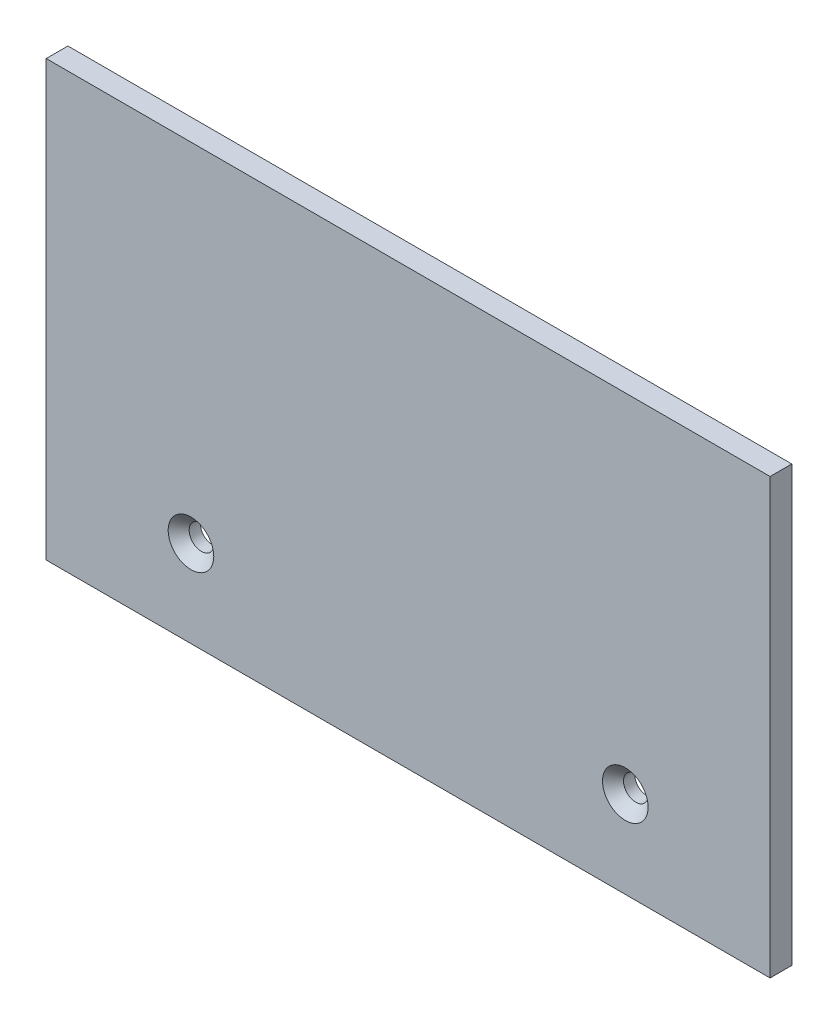
ISO-10303-21;
HEADER;
FILE_DESCRIPTION(('STEP AP214'),'2;1');
FILE_NAME('part.step','',(''),(''),'','','');
FILE_SCHEMA(('AUTOMOTIVE_DESIGN { 1 0 10303 214 1 1 1 1 }'));
ENDSEC;
DATA;
#1=APPLICATION_CONTEXT('core data for automotive mechanical design processes');
#2=APPLICATION_PROTOCOL_DEFINITION('international standard','automotive_design',2000,#1);
#3=PRODUCT_CONTEXT('',#1,'mechanical');
#4=PRODUCT('Part','Part','',(#3));
#5=PRODUCT_RELATED_PRODUCT_CATEGORY('part','',(#4));
#6=PRODUCT_DEFINITION_FORMATION('','',#4);
#7=PRODUCT_DEFINITION_CONTEXT('part definition',#1,'design');
#8=PRODUCT_DEFINITION('design','',#6,#7);
#9=PRODUCT_DEFINITION_SHAPE('','',#8);
#10=(LENGTH_UNIT() NAMED_UNIT(*) SI_UNIT(.MILLI.,.METRE.));
#11=(NAMED_UNIT(*) PLANE_ANGLE_UNIT() SI_UNIT($,.RADIAN.));
#12=(NAMED_UNIT(*) SI_UNIT($,.STERADIAN.) SOLID_ANGLE_UNIT());
#13=UNCERTAINTY_MEASURE_WITH_UNIT(LENGTH_MEASURE(1.E-05),#10,'distance_accuracy_value','');
#14=(GEOMETRIC_REPRESENTATION_CONTEXT(3) GLOBAL_UNCERTAINTY_ASSIGNED_CONTEXT((#13)) GLOBAL_UNIT_ASSIGNED_CONTEXT((#10,
#11,#12)) REPRESENTATION_CONTEXT('',''));
#15=CARTESIAN_POINT('',(0.,0.,0.));
#16=DIRECTION('',(0.,0.,1.));
#17=DIRECTION('',(1.,0.,0.));
#18=AXIS2_PLACEMENT_3D('',#15,#16,#17);
#19=CARTESIAN_POINT('',(0.,0.,-1.5));
#20=DIRECTION('',(0.,0.,-1.));
#21=DIRECTION('',(-1.,0.,0.));
#22=AXIS2_PLACEMENT_3D('',#19,#20,#21);
#23=PLANE('',#22);
#24=CARTESIAN_POINT('',(-30.,-18.,-1.5));
#25=DIRECTION('',(0.,0.,1.));
#26=DIRECTION('',(1.,0.,0.));
#27=AXIS2_PLACEMENT_3D('',#24,#25,#26);
#28=CIRCLE('',#27,1.7);
#29=CARTESIAN_POINT('',(-28.3,-18.,-1.5));
#30=VERTEX_POINT('',#29);
#31=EDGE_CURVE('E543',#30,#30,#28,.T.);
#32=ORIENTED_EDGE('',*,*,#31,.T.);
#33=EDGE_LOOP('',(#32));
#34=FACE_BOUND('',#33,.T.);
#35=DIRECTION('',(0.,-1.,0.));
#36=VECTOR('',#35,1.);
#37=CARTESIAN_POINT('',(-50.,30.,-1.5));
#38=LINE('',#37,#36);
#39=CARTESIAN_POINT('',(-50.,30.,-1.5));
#40=VERTEX_POINT('',#39);
#41=CARTESIAN_POINT('',(-50.,-30.,-1.5));
#42=VERTEX_POINT('',#41);
#43=EDGE_CURVE('E509',#40,#42,#38,.T.);
#44=ORIENTED_EDGE('',*,*,#43,.F.);
#45=DIRECTION('',(-1.,0.,0.));
#46=VECTOR('',#45,1.);
#47=CARTESIAN_POINT('',(50.,30.,-1.5));
#48=LINE('',#47,#46);
#49=CARTESIAN_POINT('',(50.,30.,-1.5));
#50=VERTEX_POINT('',#49);
#51=EDGE_CURVE('E477',#50,#40,#48,.T.);
#52=ORIENTED_EDGE('',*,*,#51,.F.);
#53=DIRECTION('',(0.,1.,0.));
#54=VECTOR('',#53,1.);
#55=CARTESIAN_POINT('',(50.,30.,-1.5));
#56=LINE('',#55,#54);
#57=CARTESIAN_POINT('',(50.,-30.,-1.5));
#58=VERTEX_POINT('',#57);
#59=EDGE_CURVE('E475',#58,#50,#56,.T.);
#60=ORIENTED_EDGE('',*,*,#59,.F.);
#61=DIRECTION('',(1.,0.,0.));
#62=VECTOR('',#61,1.);
#63=CARTESIAN_POINT('',(50.,-30.,-1.5));
#64=LINE('',#63,#62);
#65=EDGE_CURVE('E500',#42,#58,#64,.T.);
#66=ORIENTED_EDGE('',*,*,#65,.F.);
#67=EDGE_LOOP('',(#44,#52,#60,#66));
#68=FACE_BOUND('',#67,.T.);
#69=CARTESIAN_POINT('',(30.,-18.,-1.5));
#70=DIRECTION('',(0.,0.,1.));
#71=DIRECTION('',(1.,0.,0.));
#72=AXIS2_PLACEMENT_3D('',#69,#70,#71);
#73=CIRCLE('',#72,1.7);
#74=CARTESIAN_POINT('',(31.7,-18.,-1.5));
#75=VERTEX_POINT('',#74);
#76=EDGE_CURVE('E511',#75,#75,#73,.T.);
#77=ORIENTED_EDGE('',*,*,#76,.T.);
#78=EDGE_LOOP('',(#77));
#79=FACE_BOUND('',#78,.T.);
#80=ADVANCED_FACE('F438',(#34,#68,#79),#23,.T.);
#81=CARTESIAN_POINT('',(-50.,30.,1.5));
#82=DIRECTION('',(1.,0.,0.));
#83=DIRECTION('',(0.,1.,0.));
#84=AXIS2_PLACEMENT_3D('',#81,#82,#83);
#85=PLANE('',#84);
#86=ORIENTED_EDGE('',*,*,#43,.T.);
#87=DIRECTION('',(0.,0.,-1.));
#88=VECTOR('',#87,1.);
#89=CARTESIAN_POINT('',(-50.,-30.,1.5));
#90=LINE('',#89,#88);
#91=CARTESIAN_POINT('',(-50.,-30.,1.5));
#92=VERTEX_POINT('',#91);
#93=EDGE_CURVE('E12',#92,#42,#90,.T.);
#94=ORIENTED_EDGE('',*,*,#93,.F.);
#95=DIRECTION('',(0.,-1.,0.));
#96=VECTOR('',#95,1.);
#97=CARTESIAN_POINT('',(-50.,30.,1.5));
#98=LINE('',#97,#96);
#99=CARTESIAN_POINT('',(-50.,30.,1.5));
#100=VERTEX_POINT('',#99);
#101=EDGE_CURVE('E495',#100,#92,#98,.T.);
#102=ORIENTED_EDGE('',*,*,#101,.F.);
#103=DIRECTION('',(0.,0.,-1.));
#104=VECTOR('',#103,1.);
#105=CARTESIAN_POINT('',(-50.,30.,1.5));
#106=LINE('',#105,#104);
#107=EDGE_CURVE('E503',#100,#40,#106,.T.);
#108=ORIENTED_EDGE('',*,*,#107,.T.);
#109=EDGE_LOOP('',(#86,#94,#102,#108));
#110=FACE_BOUND('',#109,.T.);
#111=ADVANCED_FACE('F442',(#110),#85,.F.);
#112=CARTESIAN_POINT('',(50.,-30.,1.5));
#113=DIRECTION('',(0.,1.,0.));
#114=DIRECTION('',(-1.,0.,0.));
#115=AXIS2_PLACEMENT_3D('',#112,#113,#114);
#116=PLANE('',#115);
#117=ORIENTED_EDGE('',*,*,#65,.T.);
#118=DIRECTION('',(0.,0.,-1.));
#119=VECTOR('',#118,1.);
#120=CARTESIAN_POINT('',(50.,-30.,1.5));
#121=LINE('',#120,#119);
#122=CARTESIAN_POINT('',(50.,-30.,1.5));
#123=VERTEX_POINT('',#122);
#124=EDGE_CURVE('E446',#123,#58,#121,.T.);
#125=ORIENTED_EDGE('',*,*,#124,.F.);
#126=DIRECTION('',(1.,0.,0.));
#127=VECTOR('',#126,1.);
#128=CARTESIAN_POINT('',(50.,-30.,1.5));
#129=LINE('',#128,#127);
#130=EDGE_CURVE('E490',#92,#123,#129,.T.);
#131=ORIENTED_EDGE('',*,*,#130,.F.);
#132=ORIENTED_EDGE('',*,*,#93,.T.);
#133=EDGE_LOOP('',(#117,#125,#131,#132));
#134=FACE_BOUND('',#133,.T.);
#135=ADVANCED_FACE('F497',(#134),#116,.F.);
#136=CARTESIAN_POINT('',(50.,30.,1.5));
#137=DIRECTION('',(-1.,0.,0.));
#138=DIRECTION('',(0.,-1.,0.));
#139=AXIS2_PLACEMENT_3D('',#136,#137,#138);
#140=PLANE('',#139);
#141=ORIENTED_EDGE('',*,*,#59,.T.);
#142=DIRECTION('',(0.,0.,-1.));
#143=VECTOR('',#142,1.);
#144=CARTESIAN_POINT('',(50.,30.,1.5));
#145=LINE('',#144,#143);
#146=CARTESIAN_POINT('',(50.,30.,1.5));
#147=VERTEX_POINT('',#146);
#148=EDGE_CURVE('E496',#147,#50,#145,.T.);
#149=ORIENTED_EDGE('',*,*,#148,.F.);
#150=DIRECTION('',(0.,1.,0.));
#151=VECTOR('',#150,1.);
#152=CARTESIAN_POINT('',(50.,30.,1.5));
#153=LINE('',#152,#151);
#154=EDGE_CURVE('E489',#123,#147,#153,.T.);
#155=ORIENTED_EDGE('',*,*,#154,.F.);
#156=ORIENTED_EDGE('',*,*,#124,.T.);
#157=EDGE_LOOP('',(#141,#149,#155,#156));
#158=FACE_BOUND('',#157,.T.);
#159=ADVANCED_FACE('F498',(#158),#140,.F.);
#160=CARTESIAN_POINT('',(50.,30.,1.5));
#161=DIRECTION('',(0.,-1.,0.));
#162=DIRECTION('',(1.,0.,0.));
#163=AXIS2_PLACEMENT_3D('',#160,#161,#162);
#164=PLANE('',#163);
#165=ORIENTED_EDGE('',*,*,#51,.T.);
#166=ORIENTED_EDGE('',*,*,#107,.F.);
#167=DIRECTION('',(-1.,0.,0.));
#168=VECTOR('',#167,1.);
#169=CARTESIAN_POINT('',(50.,30.,1.5));
#170=LINE('',#169,#168);
#171=EDGE_CURVE('E460',#147,#100,#170,.T.);
#172=ORIENTED_EDGE('',*,*,#171,.F.);
#173=ORIENTED_EDGE('',*,*,#148,.T.);
#174=EDGE_LOOP('',(#165,#166,#172,#173));
#175=FACE_BOUND('',#174,.T.);
#176=ADVANCED_FACE('F523',(#175),#164,.F.);
#177=CARTESIAN_POINT('',(0.,0.,1.5));
#178=DIRECTION('',(0.,0.,-1.));
#179=DIRECTION('',(-1.,0.,0.));
#180=AXIS2_PLACEMENT_3D('',#177,#178,#179);
#181=PLANE('',#180);
#182=CARTESIAN_POINT('',(-30.,-18.,1.5));
#183=DIRECTION('',(0.,0.,1.));
#184=DIRECTION('',(1.,0.,0.));
#185=AXIS2_PLACEMENT_3D('',#182,#183,#184);
#186=CIRCLE('',#185,3.15);
#187=CARTESIAN_POINT('',(-26.85,-18.,1.5));
#188=VERTEX_POINT('',#187);
#189=EDGE_CURVE('E552',#188,#188,#186,.T.);
#190=ORIENTED_EDGE('',*,*,#189,.F.);
#191=EDGE_LOOP('',(#190));
#192=FACE_BOUND('',#191,.T.);
#193=CARTESIAN_POINT('',(30.,-18.,1.5));
#194=DIRECTION('',(0.,0.,1.));
#195=DIRECTION('',(1.,0.,0.));
#196=AXIS2_PLACEMENT_3D('',#193,#194,#195);
#197=CIRCLE('',#196,3.15);
#198=CARTESIAN_POINT('',(33.15,-18.,1.5));
#199=VERTEX_POINT('',#198);
#200=EDGE_CURVE('E537',#199,#199,#197,.T.);
#201=ORIENTED_EDGE('',*,*,#200,.F.);
#202=EDGE_LOOP('',(#201));
#203=FACE_BOUND('',#202,.T.);
#204=ORIENTED_EDGE('',*,*,#101,.T.);
#205=ORIENTED_EDGE('',*,*,#130,.T.);
#206=ORIENTED_EDGE('',*,*,#154,.T.);
#207=ORIENTED_EDGE('',*,*,#171,.T.);
#208=EDGE_LOOP('',(#204,#205,#206,#207));
#209=FACE_BOUND('',#208,.T.);
#210=ADVANCED_FACE('F488',(#192,#203,#209),#181,.F.);
#211=CARTESIAN_POINT('',(30.,-18.,1.5));
#212=DIRECTION('',(0.,0.,1.));
#213=DIRECTION('',(1.,0.,0.));
#214=AXIS2_PLACEMENT_3D('',#211,#212,#213);
#215=CYLINDRICAL_SURFACE('',#214,1.7);
#216=ORIENTED_EDGE('',*,*,#76,.F.);
#217=EDGE_LOOP('',(#216));
#218=FACE_BOUND('',#217,.T.);
#219=CARTESIAN_POINT('',(30.,-18.,0.0499999999999995));
#220=DIRECTION('',(0.,0.,1.));
#221=DIRECTION('',(1.,0.,0.));
#222=AXIS2_PLACEMENT_3D('',#219,#220,#221);
#223=CIRCLE('',#222,1.7);
#224=CARTESIAN_POINT('',(31.7,-18.,0.0499999999999995));
#225=VERTEX_POINT('',#224);
#226=EDGE_CURVE('E532',#225,#225,#223,.T.);
#227=ORIENTED_EDGE('',*,*,#226,.T.);
#228=EDGE_LOOP('',(#227));
#229=FACE_BOUND('',#228,.T.);
#230=ADVANCED_FACE('F563',(#218,#229),#215,.F.);
#231=CARTESIAN_POINT('',(30.,-18.,1.5));
#232=DIRECTION('',(0.,0.,1.));
#233=DIRECTION('',(1.,0.,0.));
#234=AXIS2_PLACEMENT_3D('',#231,#232,#233);
#235=CONICAL_SURFACE('',#234,3.15,0.785398163397448);
#236=ORIENTED_EDGE('',*,*,#226,.F.);
#237=EDGE_LOOP('',(#236));
#238=FACE_BOUND('',#237,.T.);
#239=ORIENTED_EDGE('',*,*,#200,.T.);
#240=EDGE_LOOP('',(#239));
#241=FACE_BOUND('',#240,.T.);
#242=ADVANCED_FACE('F562',(#238,#241),#235,.F.);
#243=CARTESIAN_POINT('',(-30.,-18.,1.5));
#244=DIRECTION('',(0.,0.,1.));
#245=DIRECTION('',(1.,0.,0.));
#246=AXIS2_PLACEMENT_3D('',#243,#244,#245);
#247=CYLINDRICAL_SURFACE('',#246,1.7);
#248=ORIENTED_EDGE('',*,*,#31,.F.);
#249=EDGE_LOOP('',(#248));
#250=FACE_BOUND('',#249,.T.);
#251=CARTESIAN_POINT('',(-30.,-18.,0.0499999999999995));
#252=DIRECTION('',(0.,0.,1.));
#253=DIRECTION('',(1.,0.,0.));
#254=AXIS2_PLACEMENT_3D('',#251,#252,#253);
#255=CIRCLE('',#254,1.7);
#256=CARTESIAN_POINT('',(-28.3,-18.,0.0499999999999995));
#257=VERTEX_POINT('',#256);
#258=EDGE_CURVE('E550',#257,#257,#255,.T.);
#259=ORIENTED_EDGE('',*,*,#258,.T.);
#260=EDGE_LOOP('',(#259));
#261=FACE_BOUND('',#260,.T.);
#262=ADVANCED_FACE('F570',(#250,#261),#247,.F.);
#263=CARTESIAN_POINT('',(-30.,-18.,1.5));
#264=DIRECTION('',(0.,0.,1.));
#265=DIRECTION('',(1.,0.,0.));
#266=AXIS2_PLACEMENT_3D('',#263,#264,#265);
#267=CONICAL_SURFACE('',#266,3.15,0.785398163397448);
#268=ORIENTED_EDGE('',*,*,#258,.F.);
#269=EDGE_LOOP('',(#268));
#270=FACE_BOUND('',#269,.T.);
#271=ORIENTED_EDGE('',*,*,#189,.T.);
#272=EDGE_LOOP('',(#271));
#273=FACE_BOUND('',#272,.T.);
#274=ADVANCED_FACE('F560',(#270,#273),#267,.F.);
#275=CLOSED_SHELL('',(#80,#111,#135,#159,#176,#210,#230,#242,#262,#274));
#276=MANIFOLD_SOLID_BREP('B2',#275);
#277=ADVANCED_BREP_SHAPE_REPRESENTATION('',(#18,#276),#14);
#278=SHAPE_DEFINITION_REPRESENTATION(#9,#277);
ENDSEC;
END-ISO-10303-21;
